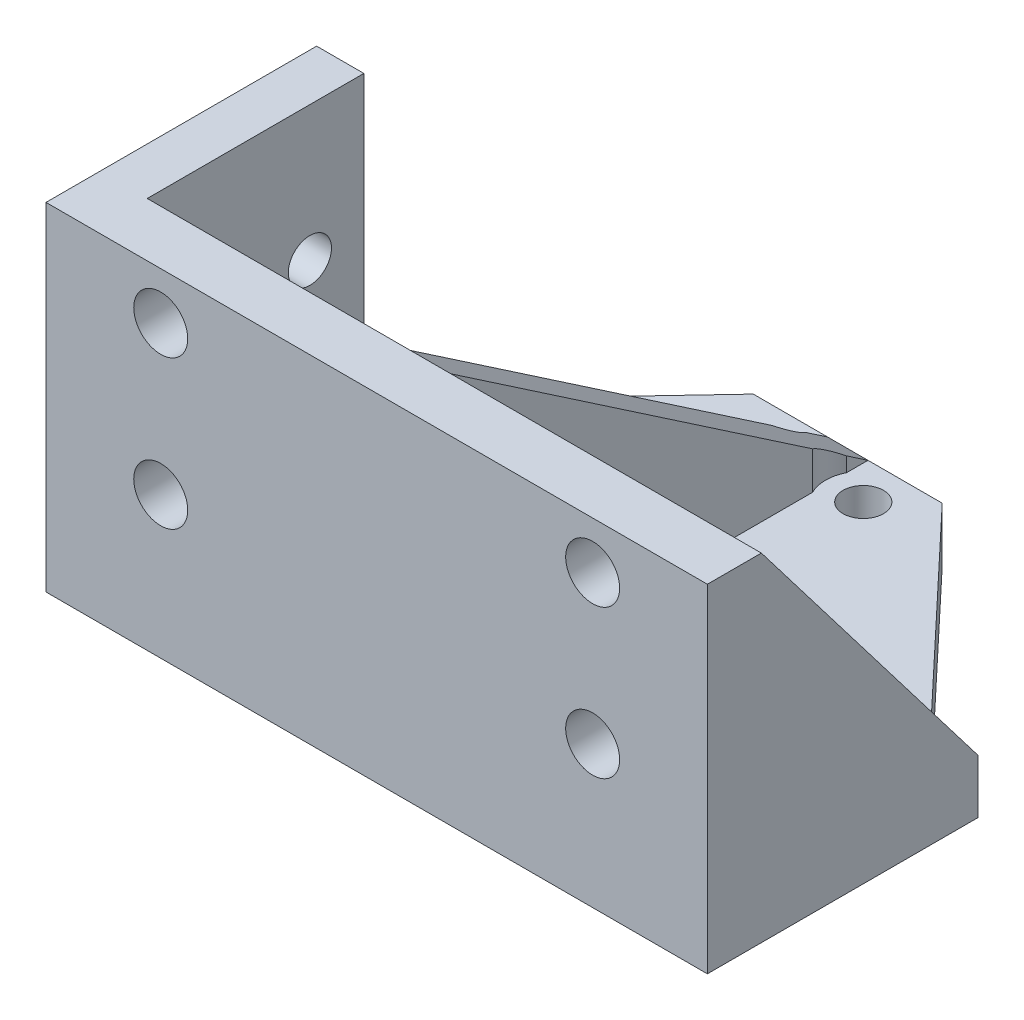
ISO-10303-21;
HEADER;
FILE_DESCRIPTION(('STEP AP214'),'2;1');
FILE_NAME('part.step','',(''),(''),'','','');
FILE_SCHEMA(('AUTOMOTIVE_DESIGN { 1 0 10303 214 1 1 1 1 }'));
ENDSEC;
DATA;
#1=APPLICATION_CONTEXT('core data for automotive mechanical design processes');
#2=APPLICATION_PROTOCOL_DEFINITION('international standard','automotive_design',2000,#1);
#3=PRODUCT_CONTEXT('',#1,'mechanical');
#4=PRODUCT('Part','Part','',(#3));
#5=PRODUCT_RELATED_PRODUCT_CATEGORY('part','',(#4));
#6=PRODUCT_DEFINITION_FORMATION('','',#4);
#7=PRODUCT_DEFINITION_CONTEXT('part definition',#1,'design');
#8=PRODUCT_DEFINITION('design','',#6,#7);
#9=PRODUCT_DEFINITION_SHAPE('','',#8);
#10=(LENGTH_UNIT() NAMED_UNIT(*) SI_UNIT(.MILLI.,.METRE.));
#11=(NAMED_UNIT(*) PLANE_ANGLE_UNIT() SI_UNIT($,.RADIAN.));
#12=(NAMED_UNIT(*) SI_UNIT($,.STERADIAN.) SOLID_ANGLE_UNIT());
#13=UNCERTAINTY_MEASURE_WITH_UNIT(LENGTH_MEASURE(1.E-05),#10,'distance_accuracy_value','');
#14=(GEOMETRIC_REPRESENTATION_CONTEXT(3) GLOBAL_UNCERTAINTY_ASSIGNED_CONTEXT((#13)) GLOBAL_UNIT_ASSIGNED_CONTEXT((#10,
#11,#12)) REPRESENTATION_CONTEXT('',''));
#15=CARTESIAN_POINT('',(0.,0.,0.));
#16=DIRECTION('',(0.,0.,1.));
#17=DIRECTION('',(1.,0.,0.));
#18=AXIS2_PLACEMENT_3D('',#15,#16,#17);
#19=CARTESIAN_POINT('',(23.,0.,0.));
#20=DIRECTION('',(-1.,0.,0.));
#21=DIRECTION('',(0.,0.,1.));
#22=AXIS2_PLACEMENT_3D('',#19,#20,#21);
#23=PLANE('',#22);
#24=DIRECTION('',(0.,1.,0.));
#25=VECTOR('',#24,1.);
#26=CARTESIAN_POINT('',(23.,1.46031498015992,-30.7890479787081));
#27=LINE('',#26,#25);
#28=CARTESIAN_POINT('',(23.,4.,-30.7890479787081));
#29=VERTEX_POINT('',#28);
#30=CARTESIAN_POINT('',(23.,6.7938508882566,-30.7890479787081));
#31=VERTEX_POINT('',#30);
#32=EDGE_CURVE('E52',#29,#31,#27,.T.);
#33=ORIENTED_EDGE('',*,*,#32,.F.);
#34=DIRECTION('',(0.,0.,-1.));
#35=VECTOR('',#34,1.);
#36=CARTESIAN_POINT('',(23.,4.,-34.9));
#37=LINE('',#36,#35);
#38=CARTESIAN_POINT('',(23.,4.,-4.));
#39=VERTEX_POINT('',#38);
#40=EDGE_CURVE('E193',#39,#29,#37,.T.);
#41=ORIENTED_EDGE('',*,*,#40,.F.);
#42=DIRECTION('',(0.,-1.,0.));
#43=VECTOR('',#42,1.);
#44=CARTESIAN_POINT('',(23.,4.,-4.));
#45=LINE('',#44,#43);
#46=CARTESIAN_POINT('',(23.,25.,-4.));
#47=VERTEX_POINT('',#46);
#48=EDGE_CURVE('E382',#47,#39,#45,.T.);
#49=ORIENTED_EDGE('',*,*,#48,.F.);
#50=DIRECTION('',(0.,0.562090366387661,0.827075824827558));
#51=VECTOR('',#50,1.);
#52=CARTESIAN_POINT('',(23.,25.,-4.));
#53=LINE('',#52,#51);
#54=EDGE_CURVE('E369',#31,#47,#53,.T.);
#55=ORIENTED_EDGE('',*,*,#54,.F.);
#56=EDGE_LOOP('',(#33,#41,#49,#55));
#57=FACE_BOUND('',#56,.T.);
#58=ADVANCED_FACE('F36',(#57),#23,.T.);
#59=CARTESIAN_POINT('',(26.,0.,0.));
#60=DIRECTION('',(-1.,0.,0.));
#61=DIRECTION('',(0.,0.,1.));
#62=AXIS2_PLACEMENT_3D('',#59,#60,#61);
#63=PLANE('',#62);
#64=DIRECTION('',(0.,0.,-1.));
#65=VECTOR('',#64,1.);
#66=CARTESIAN_POINT('',(26.,4.,-34.9));
#67=LINE('',#66,#65);
#68=CARTESIAN_POINT('',(26.,4.,-4.));
#69=VERTEX_POINT('',#68);
#70=CARTESIAN_POINT('',(26.,4.,-30.7890479787081));
#71=VERTEX_POINT('',#70);
#72=EDGE_CURVE('E380',#69,#71,#67,.T.);
#73=ORIENTED_EDGE('',*,*,#72,.T.);
#74=DIRECTION('',(0.,1.,0.));
#75=VECTOR('',#74,1.);
#76=CARTESIAN_POINT('',(26.,1.46031498015992,-30.7890479787081));
#77=LINE('',#76,#75);
#78=CARTESIAN_POINT('',(26.,6.7938508882566,-30.7890479787081));
#79=VERTEX_POINT('',#78);
#80=EDGE_CURVE('E347',#71,#79,#77,.T.);
#81=ORIENTED_EDGE('',*,*,#80,.T.);
#82=DIRECTION('',(0.,0.562090366387661,0.827075824827558));
#83=VECTOR('',#82,1.);
#84=CARTESIAN_POINT('',(26.,25.,-4.));
#85=LINE('',#84,#83);
#86=CARTESIAN_POINT('',(26.,25.,-4.));
#87=VERTEX_POINT('',#86);
#88=EDGE_CURVE('E326',#79,#87,#85,.T.);
#89=ORIENTED_EDGE('',*,*,#88,.T.);
#90=DIRECTION('',(0.,-1.,0.));
#91=VECTOR('',#90,1.);
#92=CARTESIAN_POINT('',(26.,4.,-4.));
#93=LINE('',#92,#91);
#94=EDGE_CURVE('E376',#87,#69,#93,.T.);
#95=ORIENTED_EDGE('',*,*,#94,.T.);
#96=EDGE_LOOP('',(#73,#81,#89,#95));
#97=FACE_BOUND('',#96,.T.);
#98=ADVANCED_FACE('F436',(#97),#63,.F.);
#99=CARTESIAN_POINT('',(49.,4.,-34.9));
#100=DIRECTION('',(0.,-1.,0.));
#101=DIRECTION('',(0.,0.,-1.));
#102=AXIS2_PLACEMENT_3D('',#99,#100,#101);
#103=PLANE('',#102);
#104=CARTESIAN_POINT('',(42.5,4.,-15.55));
#105=DIRECTION('',(0.,1.,0.));
#106=DIRECTION('',(0.,0.,1.));
#107=AXIS2_PLACEMENT_3D('',#104,#105,#106);
#108=CIRCLE('',#107,1.5);
#109=CARTESIAN_POINT('',(42.5,4.,-14.05));
#110=VERTEX_POINT('',#109);
#111=EDGE_CURVE('E245',#110,#110,#108,.T.);
#112=ORIENTED_EDGE('',*,*,#111,.F.);
#113=EDGE_LOOP('',(#112));
#114=FACE_BOUND('',#113,.T.);
#115=CARTESIAN_POINT('',(28.5,4.,-32.05));
#116=DIRECTION('',(0.,1.,0.));
#117=DIRECTION('',(0.,0.,-1.));
#118=AXIS2_PLACEMENT_3D('',#115,#116,#117);
#119=CIRCLE('',#118,1.5);
#120=CARTESIAN_POINT('',(28.5,4.,-33.55));
#121=VERTEX_POINT('',#120);
#122=EDGE_CURVE('E272',#121,#121,#119,.T.);
#123=ORIENTED_EDGE('',*,*,#122,.F.);
#124=EDGE_LOOP('',(#123));
#125=FACE_BOUND('',#124,.T.);
#126=CARTESIAN_POINT('',(29.5,4.,-8.55));
#127=DIRECTION('',(0.,1.,0.));
#128=DIRECTION('',(0.,0.,1.));
#129=AXIS2_PLACEMENT_3D('',#126,#127,#128);
#130=CIRCLE('',#129,1.5);
#131=CARTESIAN_POINT('',(29.5,4.,-7.05));
#132=VERTEX_POINT('',#131);
#133=EDGE_CURVE('E215',#132,#132,#130,.T.);
#134=ORIENTED_EDGE('',*,*,#133,.F.);
#135=EDGE_LOOP('',(#134));
#136=FACE_BOUND('',#135,.T.);
#137=ORIENTED_EDGE('',*,*,#72,.F.);
#138=DIRECTION('',(-1.,0.,0.));
#139=VECTOR('',#138,1.);
#140=CARTESIAN_POINT('',(49.,4.,-4.));
#141=LINE('',#140,#139);
#142=CARTESIAN_POINT('',(45.5,4.,-4.));
#143=VERTEX_POINT('',#142);
#144=EDGE_CURVE('E304',#143,#69,#141,.T.);
#145=ORIENTED_EDGE('',*,*,#144,.F.);
#146=DIRECTION('',(0.,0.,1.));
#147=VECTOR('',#146,1.);
#148=CARTESIAN_POINT('',(45.5,4.,-34.9));
#149=LINE('',#148,#147);
#150=CARTESIAN_POINT('',(45.5,4.,-20.05));
#151=VERTEX_POINT('',#150);
#152=EDGE_CURVE('E209',#151,#143,#149,.T.);
#153=ORIENTED_EDGE('',*,*,#152,.F.);
#154=DIRECTION('',(0.685975812061838,0.,0.727624343508449));
#155=VECTOR('',#154,1.);
#156=CARTESIAN_POINT('',(31.5,4.,-34.9));
#157=LINE('',#156,#155);
#158=CARTESIAN_POINT('',(31.5,4.,-34.9));
#159=VERTEX_POINT('',#158);
#160=EDGE_CURVE('E232',#159,#151,#157,.T.);
#161=ORIENTED_EDGE('',*,*,#160,.F.);
#162=DIRECTION('',(-1.,0.,0.));
#163=VECTOR('',#162,1.);
#164=CARTESIAN_POINT('',(49.,4.,-34.9));
#165=LINE('',#164,#163);
#166=CARTESIAN_POINT('',(26.,4.,-34.9));
#167=VERTEX_POINT('',#166);
#168=EDGE_CURVE('E308',#159,#167,#165,.T.);
#169=ORIENTED_EDGE('',*,*,#168,.T.);
#170=CARTESIAN_POINT('',(26.,4.,-33.3109520212919));
#171=VERTEX_POINT('',#170);
#172=EDGE_CURVE('E379',#171,#167,#67,.T.);
#173=ORIENTED_EDGE('',*,*,#172,.F.);
#174=CARTESIAN_POINT('',(28.5,4.,-32.05));
#175=DIRECTION('',(0.,-1.,0.));
#176=DIRECTION('',(0.,0.,-1.));
#177=AXIS2_PLACEMENT_3D('',#174,#175,#176);
#178=CIRCLE('',#177,2.8);
#179=EDGE_CURVE('E351',#171,#71,#178,.F.);
#180=ORIENTED_EDGE('',*,*,#179,.T.);
#181=EDGE_LOOP('',(#137,#145,#153,#161,#169,#173,#180));
#182=FACE_BOUND('',#181,.T.);
#183=ADVANCED_FACE('F441',(#114,#125,#136,#182),#103,.F.);
#184=CARTESIAN_POINT('',(49.,4.,-4.));
#185=DIRECTION('',(0.,0.,1.));
#186=DIRECTION('',(1.,0.,0.));
#187=AXIS2_PLACEMENT_3D('',#184,#185,#186);
#188=PLANE('',#187);
#189=CARTESIAN_POINT('',(40.5,21.4999999999999,-4.));
#190=DIRECTION('',(0.,0.,-1.));
#191=DIRECTION('',(0.,1.,0.));
#192=AXIS2_PLACEMENT_3D('',#189,#190,#191);
#193=CIRCLE('',#192,2.00000000000008);
#194=CARTESIAN_POINT('',(40.5,23.5,-4.));
#195=VERTEX_POINT('',#194);
#196=EDGE_CURVE('E350',#195,#195,#193,.T.);
#197=ORIENTED_EDGE('',*,*,#196,.F.);
#198=EDGE_LOOP('',(#197));
#199=FACE_BOUND('',#198,.T.);
#200=CARTESIAN_POINT('',(40.5,10.4999999999999,-4.));
#201=DIRECTION('',(0.,0.,-1.));
#202=DIRECTION('',(0.,1.,0.));
#203=AXIS2_PLACEMENT_3D('',#200,#201,#202);
#204=CIRCLE('',#203,2.00000000000007);
#205=CARTESIAN_POINT('',(40.5,12.5,-4.));
#206=VERTEX_POINT('',#205);
#207=EDGE_CURVE('E359',#206,#206,#204,.T.);
#208=ORIENTED_EDGE('',*,*,#207,.F.);
#209=EDGE_LOOP('',(#208));
#210=FACE_BOUND('',#209,.T.);
#211=ORIENTED_EDGE('',*,*,#94,.F.);
#212=DIRECTION('',(-1.,0.,0.));
#213=VECTOR('',#212,1.);
#214=CARTESIAN_POINT('',(49.,25.,-4.));
#215=LINE('',#214,#213);
#216=CARTESIAN_POINT('',(45.5,25.,-4.));
#217=VERTEX_POINT('',#216);
#218=EDGE_CURVE('E185',#217,#87,#215,.T.);
#219=ORIENTED_EDGE('',*,*,#218,.F.);
#220=DIRECTION('',(0.,1.,0.));
#221=VECTOR('',#220,1.);
#222=CARTESIAN_POINT('',(45.5,4.,-4.));
#223=LINE('',#222,#221);
#224=EDGE_CURVE('E205',#143,#217,#223,.T.);
#225=ORIENTED_EDGE('',*,*,#224,.F.);
#226=ORIENTED_EDGE('',*,*,#144,.T.);
#227=EDGE_LOOP('',(#211,#219,#225,#226));
#228=FACE_BOUND('',#227,.T.);
#229=ADVANCED_FACE('F519',(#199,#210,#228),#188,.F.);
#230=CARTESIAN_POINT('',(20.5,4.,-32.05));
#231=DIRECTION('',(0.,1.,0.));
#232=DIRECTION('',(0.,0.,1.));
#233=AXIS2_PLACEMENT_3D('',#230,#231,#232);
#234=CIRCLE('',#233,1.5);
#235=CARTESIAN_POINT('',(20.5,4.,-30.55));
#236=VERTEX_POINT('',#235);
#237=EDGE_CURVE('E271',#236,#236,#234,.T.);
#238=ORIENTED_EDGE('',*,*,#237,.F.);
#239=EDGE_LOOP('',(#238));
#240=FACE_BOUND('',#239,.T.);
#241=CARTESIAN_POINT('',(19.5,4.,-8.55));
#242=DIRECTION('',(0.,1.,0.));
#243=DIRECTION('',(0.,0.,-1.));
#244=AXIS2_PLACEMENT_3D('',#241,#242,#243);
#245=CIRCLE('',#244,1.5);
#246=CARTESIAN_POINT('',(19.5,4.,-10.05));
#247=VERTEX_POINT('',#246);
#248=EDGE_CURVE('E211',#247,#247,#245,.T.);
#249=ORIENTED_EDGE('',*,*,#248,.F.);
#250=EDGE_LOOP('',(#249));
#251=FACE_BOUND('',#250,.T.);
#252=CARTESIAN_POINT('',(6.50000000000001,4.,-15.55));
#253=DIRECTION('',(0.,1.,0.));
#254=DIRECTION('',(0.,0.,-1.));
#255=AXIS2_PLACEMENT_3D('',#252,#253,#254);
#256=CIRCLE('',#255,1.5);
#257=CARTESIAN_POINT('',(6.50000000000001,4.,-17.05));
#258=VERTEX_POINT('',#257);
#259=EDGE_CURVE('E246',#258,#258,#256,.T.);
#260=ORIENTED_EDGE('',*,*,#259,.F.);
#261=EDGE_LOOP('',(#260));
#262=FACE_BOUND('',#261,.T.);
#263=CARTESIAN_POINT('',(3.5,4.,-4.));
#264=VERTEX_POINT('',#263);
#265=EDGE_CURVE('E191',#39,#264,#141,.T.);
#266=ORIENTED_EDGE('',*,*,#265,.F.);
#267=ORIENTED_EDGE('',*,*,#40,.T.);
#268=CARTESIAN_POINT('',(20.5,4.,-32.05));
#269=DIRECTION('',(0.,-1.,0.));
#270=DIRECTION('',(0.,0.,-1.));
#271=AXIS2_PLACEMENT_3D('',#268,#269,#270);
#272=CIRCLE('',#271,2.8);
#273=CARTESIAN_POINT('',(23.,4.,-33.3109520212918));
#274=VERTEX_POINT('',#273);
#275=EDGE_CURVE('E343',#29,#274,#272,.F.);
#276=ORIENTED_EDGE('',*,*,#275,.T.);
#277=CARTESIAN_POINT('',(23.,4.,-34.9));
#278=VERTEX_POINT('',#277);
#279=EDGE_CURVE('E198',#274,#278,#37,.T.);
#280=ORIENTED_EDGE('',*,*,#279,.T.);
#281=CARTESIAN_POINT('',(17.5,4.,-34.9));
#282=VERTEX_POINT('',#281);
#283=EDGE_CURVE('E307',#278,#282,#165,.T.);
#284=ORIENTED_EDGE('',*,*,#283,.T.);
#285=DIRECTION('',(0.685975812061838,0.,-0.727624343508449));
#286=VECTOR('',#285,1.);
#287=CARTESIAN_POINT('',(17.5,4.,-34.9));
#288=LINE('',#287,#286);
#289=CARTESIAN_POINT('',(3.5,4.,-20.05));
#290=VERTEX_POINT('',#289);
#291=EDGE_CURVE('E222',#290,#282,#288,.T.);
#292=ORIENTED_EDGE('',*,*,#291,.F.);
#293=DIRECTION('',(0.,0.,1.));
#294=VECTOR('',#293,1.);
#295=CARTESIAN_POINT('',(3.5,4.,-34.9));
#296=LINE('',#295,#294);
#297=EDGE_CURVE('E192',#290,#264,#296,.T.);
#298=ORIENTED_EDGE('',*,*,#297,.T.);
#299=EDGE_LOOP('',(#266,#267,#276,#280,#284,#292,#298));
#300=FACE_BOUND('',#299,.T.);
#301=ADVANCED_FACE('F387',(#240,#251,#262,#300),#103,.F.);
#302=CARTESIAN_POINT('',(8.49999999999998,10.4999999999999,-4.));
#303=DIRECTION('',(0.,0.,-1.));
#304=DIRECTION('',(0.,1.,0.));
#305=AXIS2_PLACEMENT_3D('',#302,#303,#304);
#306=CIRCLE('',#305,2.00000000000005);
#307=CARTESIAN_POINT('',(8.49999999999998,12.5,-4.));
#308=VERTEX_POINT('',#307);
#309=EDGE_CURVE('E356',#308,#308,#306,.T.);
#310=ORIENTED_EDGE('',*,*,#309,.F.);
#311=EDGE_LOOP('',(#310));
#312=FACE_BOUND('',#311,.T.);
#313=CARTESIAN_POINT('',(8.5,21.4999999999999,-4.));
#314=DIRECTION('',(0.,0.,-1.));
#315=DIRECTION('',(0.,1.,0.));
#316=AXIS2_PLACEMENT_3D('',#313,#314,#315);
#317=CIRCLE('',#316,2.00000000000007);
#318=CARTESIAN_POINT('',(8.5,23.5,-4.));
#319=VERTEX_POINT('',#318);
#320=EDGE_CURVE('E317',#319,#319,#317,.T.);
#321=ORIENTED_EDGE('',*,*,#320,.F.);
#322=EDGE_LOOP('',(#321));
#323=FACE_BOUND('',#322,.T.);
#324=CARTESIAN_POINT('',(3.5,25.,-4.));
#325=VERTEX_POINT('',#324);
#326=EDGE_CURVE('E177',#47,#325,#215,.T.);
#327=ORIENTED_EDGE('',*,*,#326,.F.);
#328=ORIENTED_EDGE('',*,*,#48,.T.);
#329=ORIENTED_EDGE('',*,*,#265,.T.);
#330=DIRECTION('',(0.,1.,0.));
#331=VECTOR('',#330,1.);
#332=CARTESIAN_POINT('',(3.5,4.,-4.));
#333=LINE('',#332,#331);
#334=EDGE_CURVE('E168',#264,#325,#333,.T.);
#335=ORIENTED_EDGE('',*,*,#334,.T.);
#336=EDGE_LOOP('',(#327,#328,#329,#335));
#337=FACE_BOUND('',#336,.T.);
#338=ADVANCED_FACE('F189',(#312,#323,#337),#188,.F.);
#339=CARTESIAN_POINT('',(49.,0.,-34.9));
#340=DIRECTION('',(0.,1.,0.));
#341=DIRECTION('',(0.,0.,1.));
#342=AXIS2_PLACEMENT_3D('',#339,#340,#341);
#343=PLANE('',#342);
#344=DIRECTION('',(0.685975812061838,0.,-0.727624343508449));
#345=VECTOR('',#344,1.);
#346=CARTESIAN_POINT('',(17.5,0.,-34.9));
#347=LINE('',#346,#345);
#348=CARTESIAN_POINT('',(3.5,0.,-20.05));
#349=VERTEX_POINT('',#348);
#350=CARTESIAN_POINT('',(17.5,0.,-34.9));
#351=VERTEX_POINT('',#350);
#352=EDGE_CURVE('E221',#349,#351,#347,.T.);
#353=ORIENTED_EDGE('',*,*,#352,.T.);
#354=DIRECTION('',(-1.,0.,0.));
#355=VECTOR('',#354,1.);
#356=CARTESIAN_POINT('',(49.,0.,-34.9));
#357=LINE('',#356,#355);
#358=CARTESIAN_POINT('',(31.5,0.,-34.9));
#359=VERTEX_POINT('',#358);
#360=EDGE_CURVE('E311',#359,#351,#357,.T.);
#361=ORIENTED_EDGE('',*,*,#360,.F.);
#362=DIRECTION('',(0.685975812061838,0.,0.727624343508449));
#363=VECTOR('',#362,1.);
#364=CARTESIAN_POINT('',(31.5,0.,-34.9));
#365=LINE('',#364,#363);
#366=CARTESIAN_POINT('',(45.5,0.,-20.05));
#367=VERTEX_POINT('',#366);
#368=EDGE_CURVE('E250',#359,#367,#365,.T.);
#369=ORIENTED_EDGE('',*,*,#368,.T.);
#370=DIRECTION('',(1.,0.,0.));
#371=VECTOR('',#370,1.);
#372=CARTESIAN_POINT('',(49.,0.,-20.05));
#373=LINE('',#372,#371);
#374=CARTESIAN_POINT('',(49.,0.,-20.05));
#375=VERTEX_POINT('',#374);
#376=EDGE_CURVE('E253',#367,#375,#373,.T.);
#377=ORIENTED_EDGE('',*,*,#376,.T.);
#378=DIRECTION('',(0.,0.,-1.));
#379=VECTOR('',#378,1.);
#380=CARTESIAN_POINT('',(49.,0.,-34.9));
#381=LINE('',#380,#379);
#382=CARTESIAN_POINT('',(49.,0.,0.));
#383=VERTEX_POINT('',#382);
#384=EDGE_CURVE('E286',#383,#375,#381,.T.);
#385=ORIENTED_EDGE('',*,*,#384,.F.);
#386=DIRECTION('',(-1.,0.,0.));
#387=VECTOR('',#386,1.);
#388=CARTESIAN_POINT('',(49.,0.,0.));
#389=LINE('',#388,#387);
#390=CARTESIAN_POINT('',(0.,0.,0.));
#391=VERTEX_POINT('',#390);
#392=EDGE_CURVE('E294',#383,#391,#389,.T.);
#393=ORIENTED_EDGE('',*,*,#392,.T.);
#394=DIRECTION('',(0.,0.,-1.));
#395=VECTOR('',#394,1.);
#396=CARTESIAN_POINT('',(0.,0.,-34.9));
#397=LINE('',#396,#395);
#398=CARTESIAN_POINT('',(0.,0.,-20.05));
#399=VERTEX_POINT('',#398);
#400=EDGE_CURVE('E283',#391,#399,#397,.T.);
#401=ORIENTED_EDGE('',*,*,#400,.T.);
#402=DIRECTION('',(1.,0.,0.));
#403=VECTOR('',#402,1.);
#404=CARTESIAN_POINT('',(0.,0.,-20.05));
#405=LINE('',#404,#403);
#406=EDGE_CURVE('E218',#399,#349,#405,.T.);
#407=ORIENTED_EDGE('',*,*,#406,.T.);
#408=EDGE_LOOP('',(#353,#361,#369,#377,#385,#393,#401,#407));
#409=FACE_BOUND('',#408,.T.);
#410=CARTESIAN_POINT('',(20.5,0.,-32.05));
#411=DIRECTION('',(0.,1.,0.));
#412=DIRECTION('',(0.,0.,1.));
#413=AXIS2_PLACEMENT_3D('',#410,#411,#412);
#414=CIRCLE('',#413,1.5);
#415=CARTESIAN_POINT('',(20.5,0.,-30.55));
#416=VERTEX_POINT('',#415);
#417=EDGE_CURVE('E280',#416,#416,#414,.T.);
#418=ORIENTED_EDGE('',*,*,#417,.T.);
#419=EDGE_LOOP('',(#418));
#420=FACE_BOUND('',#419,.T.);
#421=CARTESIAN_POINT('',(19.5,0.,-8.55));
#422=DIRECTION('',(0.,1.,0.));
#423=DIRECTION('',(0.,0.,-1.));
#424=AXIS2_PLACEMENT_3D('',#421,#422,#423);
#425=CIRCLE('',#424,1.5);
#426=CARTESIAN_POINT('',(19.5,0.,-10.05));
#427=VERTEX_POINT('',#426);
#428=EDGE_CURVE('E212',#427,#427,#425,.T.);
#429=ORIENTED_EDGE('',*,*,#428,.T.);
#430=EDGE_LOOP('',(#429));
#431=FACE_BOUND('',#430,.T.);
#432=CARTESIAN_POINT('',(6.50000000000001,0.,-15.55));
#433=DIRECTION('',(0.,1.,0.));
#434=DIRECTION('',(0.,0.,-1.));
#435=AXIS2_PLACEMENT_3D('',#432,#433,#434);
#436=CIRCLE('',#435,1.5);
#437=CARTESIAN_POINT('',(6.50000000000001,0.,-17.05));
#438=VERTEX_POINT('',#437);
#439=EDGE_CURVE('E242',#438,#438,#436,.T.);
#440=ORIENTED_EDGE('',*,*,#439,.T.);
#441=EDGE_LOOP('',(#440));
#442=FACE_BOUND('',#441,.T.);
#443=CARTESIAN_POINT('',(42.5,0.,-15.55));
#444=DIRECTION('',(0.,1.,0.));
#445=DIRECTION('',(0.,0.,1.));
#446=AXIS2_PLACEMENT_3D('',#443,#444,#445);
#447=CIRCLE('',#446,1.5);
#448=CARTESIAN_POINT('',(42.5,0.,-14.05));
#449=VERTEX_POINT('',#448);
#450=EDGE_CURVE('E275',#449,#449,#447,.T.);
#451=ORIENTED_EDGE('',*,*,#450,.T.);
#452=EDGE_LOOP('',(#451));
#453=FACE_BOUND('',#452,.T.);
#454=CARTESIAN_POINT('',(28.5,0.,-32.05));
#455=DIRECTION('',(0.,1.,0.));
#456=DIRECTION('',(0.,0.,-1.));
#457=AXIS2_PLACEMENT_3D('',#454,#455,#456);
#458=CIRCLE('',#457,1.5);
#459=CARTESIAN_POINT('',(28.5,0.,-33.55));
#460=VERTEX_POINT('',#459);
#461=EDGE_CURVE('E268',#460,#460,#458,.T.);
#462=ORIENTED_EDGE('',*,*,#461,.T.);
#463=EDGE_LOOP('',(#462));
#464=FACE_BOUND('',#463,.T.);
#465=CARTESIAN_POINT('',(29.5,0.,-8.55));
#466=DIRECTION('',(0.,1.,0.));
#467=DIRECTION('',(0.,0.,1.));
#468=AXIS2_PLACEMENT_3D('',#465,#466,#467);
#469=CIRCLE('',#468,1.5);
#470=CARTESIAN_POINT('',(29.5,0.,-7.05));
#471=VERTEX_POINT('',#470);
#472=EDGE_CURVE('E228',#471,#471,#469,.T.);
#473=ORIENTED_EDGE('',*,*,#472,.T.);
#474=EDGE_LOOP('',(#473));
#475=FACE_BOUND('',#474,.T.);
#476=ADVANCED_FACE('F38',(#409,#420,#431,#442,#453,#464,#475),#343,.F.);
#477=CARTESIAN_POINT('',(49.,4.,-34.9));
#478=DIRECTION('',(0.,0.,1.));
#479=DIRECTION('',(1.,0.,0.));
#480=AXIS2_PLACEMENT_3D('',#477,#478,#479);
#481=PLANE('',#480);
#482=ORIENTED_EDGE('',*,*,#283,.F.);
#483=DIRECTION('',(1.,0.,0.));
#484=VECTOR('',#483,1.);
#485=CARTESIAN_POINT('',(23.,4.,-34.9));
#486=LINE('',#485,#484);
#487=EDGE_CURVE('E373',#278,#167,#486,.T.);
#488=ORIENTED_EDGE('',*,*,#487,.T.);
#489=ORIENTED_EDGE('',*,*,#168,.F.);
#490=DIRECTION('',(0.,1.,0.));
#491=VECTOR('',#490,1.);
#492=CARTESIAN_POINT('',(31.5,0.,-34.9));
#493=LINE('',#492,#491);
#494=EDGE_CURVE('E257',#359,#159,#493,.T.);
#495=ORIENTED_EDGE('',*,*,#494,.F.);
#496=ORIENTED_EDGE('',*,*,#360,.T.);
#497=DIRECTION('',(0.,1.,0.));
#498=VECTOR('',#497,1.);
#499=CARTESIAN_POINT('',(17.5,0.,-34.9));
#500=LINE('',#499,#498);
#501=EDGE_CURVE('E233',#351,#282,#500,.T.);
#502=ORIENTED_EDGE('',*,*,#501,.T.);
#503=EDGE_LOOP('',(#482,#488,#489,#495,#496,#502));
#504=FACE_BOUND('',#503,.T.);
#505=ADVANCED_FACE('F399',(#504),#481,.F.);
#506=CARTESIAN_POINT('',(49.,25.,0.));
#507=DIRECTION('',(0.,-1.,0.));
#508=DIRECTION('',(0.,0.,-1.));
#509=AXIS2_PLACEMENT_3D('',#506,#507,#508);
#510=PLANE('',#509);
#511=DIRECTION('',(0.,0.,1.));
#512=VECTOR('',#511,1.);
#513=CARTESIAN_POINT('',(0.,25.,0.));
#514=LINE('',#513,#512);
#515=CARTESIAN_POINT('',(0.,25.,-20.05));
#516=VERTEX_POINT('',#515);
#517=CARTESIAN_POINT('',(0.,25.,0.));
#518=VERTEX_POINT('',#517);
#519=EDGE_CURVE('E297',#516,#518,#514,.T.);
#520=ORIENTED_EDGE('',*,*,#519,.T.);
#521=DIRECTION('',(-1.,0.,0.));
#522=VECTOR('',#521,1.);
#523=CARTESIAN_POINT('',(49.,25.,0.));
#524=LINE('',#523,#522);
#525=CARTESIAN_POINT('',(49.,25.,0.));
#526=VERTEX_POINT('',#525);
#527=EDGE_CURVE('E186',#526,#518,#524,.T.);
#528=ORIENTED_EDGE('',*,*,#527,.F.);
#529=DIRECTION('',(0.,0.,1.));
#530=VECTOR('',#529,1.);
#531=CARTESIAN_POINT('',(49.,25.,0.));
#532=LINE('',#531,#530);
#533=CARTESIAN_POINT('',(49.,25.,-4.));
#534=VERTEX_POINT('',#533);
#535=EDGE_CURVE('E289',#534,#526,#532,.T.);
#536=ORIENTED_EDGE('',*,*,#535,.F.);
#537=EDGE_CURVE('E188',#534,#217,#215,.T.);
#538=ORIENTED_EDGE('',*,*,#537,.T.);
#539=ORIENTED_EDGE('',*,*,#218,.T.);
#540=DIRECTION('',(1.,0.,0.));
#541=VECTOR('',#540,1.);
#542=CARTESIAN_POINT('',(23.,25.,-4.));
#543=LINE('',#542,#541);
#544=EDGE_CURVE('E182',#47,#87,#543,.T.);
#545=ORIENTED_EDGE('',*,*,#544,.F.);
#546=ORIENTED_EDGE('',*,*,#326,.T.);
#547=DIRECTION('',(0.,0.,1.));
#548=VECTOR('',#547,1.);
#549=CARTESIAN_POINT('',(3.5,25.,-4.));
#550=LINE('',#549,#548);
#551=CARTESIAN_POINT('',(3.5,25.,-20.05));
#552=VERTEX_POINT('',#551);
#553=EDGE_CURVE('E163',#552,#325,#550,.T.);
#554=ORIENTED_EDGE('',*,*,#553,.F.);
#555=DIRECTION('',(1.,0.,0.));
#556=VECTOR('',#555,1.);
#557=CARTESIAN_POINT('',(-26.4310896483668,25.,-20.05));
#558=LINE('',#557,#556);
#559=EDGE_CURVE('E173',#516,#552,#558,.T.);
#560=ORIENTED_EDGE('',*,*,#559,.F.);
#561=EDGE_LOOP('',(#520,#528,#536,#538,#539,#545,#546,#554,#560));
#562=FACE_BOUND('',#561,.T.);
#563=ADVANCED_FACE('F179',(#562),#510,.F.);
#564=CARTESIAN_POINT('',(49.,0.,0.));
#565=DIRECTION('',(0.,0.,-1.));
#566=DIRECTION('',(-1.,0.,0.));
#567=AXIS2_PLACEMENT_3D('',#564,#565,#566);
#568=PLANE('',#567);
#569=CARTESIAN_POINT('',(40.5,21.4999999999999,0.));
#570=DIRECTION('',(0.,0.,-1.));
#571=DIRECTION('',(-1.,0.,0.));
#572=AXIS2_PLACEMENT_3D('',#569,#570,#571);
#573=CIRCLE('',#572,2.00000000000008);
#574=CARTESIAN_POINT('',(38.4999999999999,21.4999999999999,0.));
#575=VERTEX_POINT('',#574);
#576=EDGE_CURVE('E323',#575,#575,#573,.T.);
#577=ORIENTED_EDGE('',*,*,#576,.T.);
#578=EDGE_LOOP('',(#577));
#579=FACE_BOUND('',#578,.T.);
#580=CARTESIAN_POINT('',(40.5,10.4999999999999,0.));
#581=DIRECTION('',(0.,0.,-1.));
#582=DIRECTION('',(-1.,0.,0.));
#583=AXIS2_PLACEMENT_3D('',#580,#581,#582);
#584=CIRCLE('',#583,2.00000000000007);
#585=CARTESIAN_POINT('',(38.4999999999999,10.4999999999999,0.));
#586=VERTEX_POINT('',#585);
#587=EDGE_CURVE('E320',#586,#586,#584,.T.);
#588=ORIENTED_EDGE('',*,*,#587,.T.);
#589=EDGE_LOOP('',(#588));
#590=FACE_BOUND('',#589,.T.);
#591=CARTESIAN_POINT('',(8.49999999999998,10.4999999999999,0.));
#592=DIRECTION('',(0.,0.,-1.));
#593=DIRECTION('',(-1.,0.,0.));
#594=AXIS2_PLACEMENT_3D('',#591,#592,#593);
#595=CIRCLE('',#594,2.00000000000005);
#596=CARTESIAN_POINT('',(6.49999999999993,10.4999999999999,0.));
#597=VERTEX_POINT('',#596);
#598=EDGE_CURVE('E316',#597,#597,#595,.T.);
#599=ORIENTED_EDGE('',*,*,#598,.T.);
#600=EDGE_LOOP('',(#599));
#601=FACE_BOUND('',#600,.T.);
#602=CARTESIAN_POINT('',(8.5,21.4999999999999,0.));
#603=DIRECTION('',(0.,0.,-1.));
#604=DIRECTION('',(-1.,0.,0.));
#605=AXIS2_PLACEMENT_3D('',#602,#603,#604);
#606=CIRCLE('',#605,2.00000000000007);
#607=CARTESIAN_POINT('',(6.49999999999992,21.4999999999999,0.));
#608=VERTEX_POINT('',#607);
#609=EDGE_CURVE('E313',#608,#608,#606,.T.);
#610=ORIENTED_EDGE('',*,*,#609,.T.);
#611=EDGE_LOOP('',(#610));
#612=FACE_BOUND('',#611,.T.);
#613=DIRECTION('',(0.,-1.,0.));
#614=VECTOR('',#613,1.);
#615=CARTESIAN_POINT('',(0.,0.,0.));
#616=LINE('',#615,#614);
#617=EDGE_CURVE('E290',#518,#391,#616,.T.);
#618=ORIENTED_EDGE('',*,*,#617,.T.);
#619=ORIENTED_EDGE('',*,*,#392,.F.);
#620=DIRECTION('',(0.,-1.,0.));
#621=VECTOR('',#620,1.);
#622=CARTESIAN_POINT('',(49.,0.,0.));
#623=LINE('',#622,#621);
#624=EDGE_CURVE('E292',#526,#383,#623,.T.);
#625=ORIENTED_EDGE('',*,*,#624,.F.);
#626=ORIENTED_EDGE('',*,*,#527,.T.);
#627=EDGE_LOOP('',(#618,#619,#625,#626));
#628=FACE_BOUND('',#627,.T.);
#629=ADVANCED_FACE('F506',(#579,#590,#601,#612,#628),#568,.F.);
#630=CARTESIAN_POINT('',(49.,0.,0.));
#631=DIRECTION('',(-1.,0.,0.));
#632=DIRECTION('',(0.,0.,1.));
#633=AXIS2_PLACEMENT_3D('',#630,#631,#632);
#634=PLANE('',#633);
#635=ORIENTED_EDGE('',*,*,#384,.T.);
#636=DIRECTION('',(0.,1.,0.));
#637=VECTOR('',#636,1.);
#638=CARTESIAN_POINT('',(49.,0.,-20.05));
#639=LINE('',#638,#637);
#640=CARTESIAN_POINT('',(49.,4.,-20.05));
#641=VERTEX_POINT('',#640);
#642=EDGE_CURVE('E249',#375,#641,#639,.T.);
#643=ORIENTED_EDGE('',*,*,#642,.T.);
#644=DIRECTION('',(0.,0.794518889662865,0.607239437099475));
#645=VECTOR('',#644,1.);
#646=CARTESIAN_POINT('',(49.,4.,-20.05));
#647=LINE('',#646,#645);
#648=EDGE_CURVE('E195',#641,#534,#647,.T.);
#649=ORIENTED_EDGE('',*,*,#648,.T.);
#650=ORIENTED_EDGE('',*,*,#535,.T.);
#651=ORIENTED_EDGE('',*,*,#624,.T.);
#652=EDGE_LOOP('',(#635,#643,#649,#650,#651));
#653=FACE_BOUND('',#652,.T.);
#654=ADVANCED_FACE('F503',(#653),#634,.F.);
#655=CARTESIAN_POINT('',(0.,0.,0.));
#656=DIRECTION('',(-1.,0.,0.));
#657=DIRECTION('',(0.,0.,1.));
#658=AXIS2_PLACEMENT_3D('',#655,#656,#657);
#659=PLANE('',#658);
#660=CARTESIAN_POINT('',(0.,15.,-8.05));
#661=DIRECTION('',(-1.,0.,0.));
#662=DIRECTION('',(0.,0.,1.));
#663=AXIS2_PLACEMENT_3D('',#660,#661,#662);
#664=CIRCLE('',#663,1.6);
#665=CARTESIAN_POINT('',(0.,15.,-6.45));
#666=VERTEX_POINT('',#665);
#667=EDGE_CURVE('E329',#666,#666,#664,.T.);
#668=ORIENTED_EDGE('',*,*,#667,.F.);
#669=EDGE_LOOP('',(#668));
#670=FACE_BOUND('',#669,.T.);
#671=CARTESIAN_POINT('',(0.,15.,-16.05));
#672=DIRECTION('',(-1.,0.,0.));
#673=DIRECTION('',(0.,0.,1.));
#674=AXIS2_PLACEMENT_3D('',#671,#672,#673);
#675=CIRCLE('',#674,1.6);
#676=CARTESIAN_POINT('',(0.,15.,-14.45));
#677=VERTEX_POINT('',#676);
#678=EDGE_CURVE('E334',#677,#677,#675,.T.);
#679=ORIENTED_EDGE('',*,*,#678,.F.);
#680=EDGE_LOOP('',(#679));
#681=FACE_BOUND('',#680,.T.);
#682=DIRECTION('',(0.,1.,0.));
#683=VECTOR('',#682,1.);
#684=CARTESIAN_POINT('',(0.,0.,-20.05));
#685=LINE('',#684,#683);
#686=EDGE_CURVE('E229',#399,#516,#685,.T.);
#687=ORIENTED_EDGE('',*,*,#686,.F.);
#688=ORIENTED_EDGE('',*,*,#400,.F.);
#689=ORIENTED_EDGE('',*,*,#617,.F.);
#690=ORIENTED_EDGE('',*,*,#519,.F.);
#691=EDGE_LOOP('',(#687,#688,#689,#690));
#692=FACE_BOUND('',#691,.T.);
#693=ADVANCED_FACE('F413',(#670,#681,#692),#659,.T.);
#694=CARTESIAN_POINT('',(0.,0.,-20.05));
#695=DIRECTION('',(0.,0.,1.));
#696=DIRECTION('',(1.,0.,0.));
#697=AXIS2_PLACEMENT_3D('',#694,#695,#696);
#698=PLANE('',#697);
#699=ORIENTED_EDGE('',*,*,#686,.T.);
#700=ORIENTED_EDGE('',*,*,#559,.T.);
#701=DIRECTION('',(0.,1.,0.));
#702=VECTOR('',#701,1.);
#703=CARTESIAN_POINT('',(3.5,25.,-20.05));
#704=LINE('',#703,#702);
#705=EDGE_CURVE('E170',#290,#552,#704,.T.);
#706=ORIENTED_EDGE('',*,*,#705,.F.);
#707=DIRECTION('',(0.,1.,0.));
#708=VECTOR('',#707,1.);
#709=CARTESIAN_POINT('',(3.5,0.,-20.05));
#710=LINE('',#709,#708);
#711=EDGE_CURVE('E225',#349,#290,#710,.T.);
#712=ORIENTED_EDGE('',*,*,#711,.F.);
#713=ORIENTED_EDGE('',*,*,#406,.F.);
#714=EDGE_LOOP('',(#699,#700,#706,#712,#713));
#715=FACE_BOUND('',#714,.T.);
#716=ADVANCED_FACE('F411',(#715),#698,.F.);
#717=CARTESIAN_POINT('',(17.5,0.,-34.9));
#718=DIRECTION('',(0.727624343508449,0.,0.685975812061838));
#719=DIRECTION('',(0.685975812061838,0.,-0.727624343508449));
#720=AXIS2_PLACEMENT_3D('',#717,#718,#719);
#721=PLANE('',#720);
#722=ORIENTED_EDGE('',*,*,#291,.T.);
#723=ORIENTED_EDGE('',*,*,#501,.F.);
#724=ORIENTED_EDGE('',*,*,#352,.F.);
#725=ORIENTED_EDGE('',*,*,#711,.T.);
#726=EDGE_LOOP('',(#722,#723,#724,#725));
#727=FACE_BOUND('',#726,.T.);
#728=ADVANCED_FACE('F405',(#727),#721,.F.);
#729=CARTESIAN_POINT('',(49.,0.,-20.05));
#730=DIRECTION('',(0.,0.,1.));
#731=DIRECTION('',(1.,0.,0.));
#732=AXIS2_PLACEMENT_3D('',#729,#730,#731);
#733=PLANE('',#732);
#734=DIRECTION('',(1.,0.,0.));
#735=VECTOR('',#734,1.);
#736=CARTESIAN_POINT('',(49.,4.,-20.05));
#737=LINE('',#736,#735);
#738=EDGE_CURVE('E254',#151,#641,#737,.T.);
#739=ORIENTED_EDGE('',*,*,#738,.T.);
#740=ORIENTED_EDGE('',*,*,#642,.F.);
#741=ORIENTED_EDGE('',*,*,#376,.F.);
#742=DIRECTION('',(0.,1.,0.));
#743=VECTOR('',#742,1.);
#744=CARTESIAN_POINT('',(45.5,0.,-20.05));
#745=LINE('',#744,#743);
#746=EDGE_CURVE('E264',#367,#151,#745,.T.);
#747=ORIENTED_EDGE('',*,*,#746,.T.);
#748=EDGE_LOOP('',(#739,#740,#741,#747));
#749=FACE_BOUND('',#748,.T.);
#750=ADVANCED_FACE('F476',(#749),#733,.F.);
#751=CARTESIAN_POINT('',(31.5,0.,-34.9));
#752=DIRECTION('',(-0.727624343508449,0.,0.685975812061838));
#753=DIRECTION('',(0.685975812061838,0.,0.727624343508449));
#754=AXIS2_PLACEMENT_3D('',#751,#752,#753);
#755=PLANE('',#754);
#756=ORIENTED_EDGE('',*,*,#160,.T.);
#757=ORIENTED_EDGE('',*,*,#746,.F.);
#758=ORIENTED_EDGE('',*,*,#368,.F.);
#759=ORIENTED_EDGE('',*,*,#494,.T.);
#760=EDGE_LOOP('',(#756,#757,#758,#759));
#761=FACE_BOUND('',#760,.T.);
#762=ADVANCED_FACE('F489',(#761),#755,.F.);
#763=CARTESIAN_POINT('',(20.5,0.,-32.05));
#764=DIRECTION('',(0.,1.,0.));
#765=DIRECTION('',(0.,0.,1.));
#766=AXIS2_PLACEMENT_3D('',#763,#764,#765);
#767=CYLINDRICAL_SURFACE('',#766,1.5);
#768=ORIENTED_EDGE('',*,*,#417,.F.);
#769=EDGE_LOOP('',(#768));
#770=FACE_BOUND('',#769,.T.);
#771=ORIENTED_EDGE('',*,*,#237,.T.);
#772=EDGE_LOOP('',(#771));
#773=FACE_BOUND('',#772,.T.);
#774=ADVANCED_FACE('F481',(#770,#773),#767,.F.);
#775=CARTESIAN_POINT('',(29.5,0.,-8.55));
#776=DIRECTION('',(0.,1.,0.));
#777=DIRECTION('',(0.,0.,1.));
#778=AXIS2_PLACEMENT_3D('',#775,#776,#777);
#779=CYLINDRICAL_SURFACE('',#778,1.5);
#780=ORIENTED_EDGE('',*,*,#472,.F.);
#781=EDGE_LOOP('',(#780));
#782=FACE_BOUND('',#781,.T.);
#783=ORIENTED_EDGE('',*,*,#133,.T.);
#784=EDGE_LOOP('',(#783));
#785=FACE_BOUND('',#784,.T.);
#786=ADVANCED_FACE('F472',(#782,#785),#779,.F.);
#787=CARTESIAN_POINT('',(19.5,0.,-8.55));
#788=DIRECTION('',(0.,1.,0.));
#789=DIRECTION('',(0.,0.,1.));
#790=AXIS2_PLACEMENT_3D('',#787,#788,#789);
#791=CYLINDRICAL_SURFACE('',#790,1.5);
#792=ORIENTED_EDGE('',*,*,#428,.F.);
#793=EDGE_LOOP('',(#792));
#794=FACE_BOUND('',#793,.T.);
#795=ORIENTED_EDGE('',*,*,#248,.T.);
#796=EDGE_LOOP('',(#795));
#797=FACE_BOUND('',#796,.T.);
#798=ADVANCED_FACE('F468',(#794,#797),#791,.F.);
#799=CARTESIAN_POINT('',(28.5,0.,-32.05));
#800=DIRECTION('',(0.,1.,0.));
#801=DIRECTION('',(0.,0.,1.));
#802=AXIS2_PLACEMENT_3D('',#799,#800,#801);
#803=CYLINDRICAL_SURFACE('',#802,1.5);
#804=ORIENTED_EDGE('',*,*,#461,.F.);
#805=EDGE_LOOP('',(#804));
#806=FACE_BOUND('',#805,.T.);
#807=ORIENTED_EDGE('',*,*,#122,.T.);
#808=EDGE_LOOP('',(#807));
#809=FACE_BOUND('',#808,.T.);
#810=ADVANCED_FACE('F471',(#806,#809),#803,.F.);
#811=CARTESIAN_POINT('',(42.5,0.,-15.55));
#812=DIRECTION('',(0.,1.,0.));
#813=DIRECTION('',(0.,0.,1.));
#814=AXIS2_PLACEMENT_3D('',#811,#812,#813);
#815=CYLINDRICAL_SURFACE('',#814,1.5);
#816=ORIENTED_EDGE('',*,*,#450,.F.);
#817=EDGE_LOOP('',(#816));
#818=FACE_BOUND('',#817,.T.);
#819=ORIENTED_EDGE('',*,*,#111,.T.);
#820=EDGE_LOOP('',(#819));
#821=FACE_BOUND('',#820,.T.);
#822=ADVANCED_FACE('F485',(#818,#821),#815,.F.);
#823=CARTESIAN_POINT('',(6.50000000000001,0.,-15.55));
#824=DIRECTION('',(0.,1.,0.));
#825=DIRECTION('',(0.,0.,1.));
#826=AXIS2_PLACEMENT_3D('',#823,#824,#825);
#827=CYLINDRICAL_SURFACE('',#826,1.5);
#828=ORIENTED_EDGE('',*,*,#439,.F.);
#829=EDGE_LOOP('',(#828));
#830=FACE_BOUND('',#829,.T.);
#831=ORIENTED_EDGE('',*,*,#259,.T.);
#832=EDGE_LOOP('',(#831));
#833=FACE_BOUND('',#832,.T.);
#834=ADVANCED_FACE('F465',(#830,#833),#827,.F.);
#835=CARTESIAN_POINT('',(45.5,0.,0.));
#836=DIRECTION('',(1.,0.,0.));
#837=DIRECTION('',(0.,0.,-1.));
#838=AXIS2_PLACEMENT_3D('',#835,#836,#837);
#839=PLANE('',#838);
#840=DIRECTION('',(0.,0.794518889662865,0.607239437099475));
#841=VECTOR('',#840,1.);
#842=CARTESIAN_POINT('',(45.5,4.,-20.05));
#843=LINE('',#842,#841);
#844=EDGE_CURVE('E202',#151,#217,#843,.T.);
#845=ORIENTED_EDGE('',*,*,#844,.F.);
#846=ORIENTED_EDGE('',*,*,#152,.T.);
#847=ORIENTED_EDGE('',*,*,#224,.T.);
#848=EDGE_LOOP('',(#845,#846,#847));
#849=FACE_BOUND('',#848,.T.);
#850=ADVANCED_FACE('F458',(#849),#839,.F.);
#851=CARTESIAN_POINT('',(45.5,4.,-20.05));
#852=DIRECTION('',(0.,0.607239437099476,-0.794518889662865));
#853=DIRECTION('',(0.,0.794518889662865,0.607239437099476));
#854=AXIS2_PLACEMENT_3D('',#851,#852,#853);
#855=PLANE('',#854);
#856=ORIENTED_EDGE('',*,*,#648,.F.);
#857=ORIENTED_EDGE('',*,*,#738,.F.);
#858=ORIENTED_EDGE('',*,*,#844,.T.);
#859=ORIENTED_EDGE('',*,*,#537,.F.);
#860=EDGE_LOOP('',(#856,#857,#858,#859));
#861=FACE_BOUND('',#860,.T.);
#862=ADVANCED_FACE('F452',(#861),#855,.T.);
#863=CARTESIAN_POINT('',(3.5,0.,0.));
#864=DIRECTION('',(1.,0.,0.));
#865=DIRECTION('',(0.,0.,-1.));
#866=AXIS2_PLACEMENT_3D('',#863,#864,#865);
#867=PLANE('',#866);
#868=CARTESIAN_POINT('',(3.5,15.,-8.05));
#869=DIRECTION('',(1.,0.,0.));
#870=DIRECTION('',(0.,0.,-1.));
#871=AXIS2_PLACEMENT_3D('',#868,#869,#870);
#872=CIRCLE('',#871,1.6);
#873=CARTESIAN_POINT('',(3.5,15.,-9.65));
#874=VERTEX_POINT('',#873);
#875=EDGE_CURVE('E40',#874,#874,#872,.T.);
#876=ORIENTED_EDGE('',*,*,#875,.F.);
#877=EDGE_LOOP('',(#876));
#878=FACE_BOUND('',#877,.T.);
#879=CARTESIAN_POINT('',(3.5,15.,-16.05));
#880=DIRECTION('',(1.,0.,0.));
#881=DIRECTION('',(0.,0.,-1.));
#882=AXIS2_PLACEMENT_3D('',#879,#880,#881);
#883=CIRCLE('',#882,1.6);
#884=CARTESIAN_POINT('',(3.5,15.,-17.65));
#885=VERTEX_POINT('',#884);
#886=EDGE_CURVE('E327',#885,#885,#883,.T.);
#887=ORIENTED_EDGE('',*,*,#886,.F.);
#888=EDGE_LOOP('',(#887));
#889=FACE_BOUND('',#888,.T.);
#890=ORIENTED_EDGE('',*,*,#297,.F.);
#891=ORIENTED_EDGE('',*,*,#705,.T.);
#892=ORIENTED_EDGE('',*,*,#553,.T.);
#893=ORIENTED_EDGE('',*,*,#334,.F.);
#894=EDGE_LOOP('',(#890,#891,#892,#893));
#895=FACE_BOUND('',#894,.T.);
#896=ADVANCED_FACE('F166',(#878,#889,#895),#867,.T.);
#897=DIRECTION('',(0.,1.,0.));
#898=VECTOR('',#897,1.);
#899=CARTESIAN_POINT('',(23.,1.46031498015992,-33.3109520212918));
#900=LINE('',#899,#898);
#901=CARTESIAN_POINT('',(23.,5.07993551951039,-33.3109520212918));
#902=VERTEX_POINT('',#901);
#903=EDGE_CURVE('E345',#274,#902,#900,.T.);
#904=ORIENTED_EDGE('',*,*,#903,.T.);
#905=EDGE_CURVE('E370',#278,#902,#53,.T.);
#906=ORIENTED_EDGE('',*,*,#905,.F.);
#907=ORIENTED_EDGE('',*,*,#279,.F.);
#908=EDGE_LOOP('',(#904,#906,#907));
#909=FACE_BOUND('',#908,.T.);
#910=ADVANCED_FACE('F398',(#909),#23,.T.);
#911=CARTESIAN_POINT('',(26.,5.07993551951039,-33.3109520212918));
#912=VERTEX_POINT('',#911);
#913=EDGE_CURVE('E366',#167,#912,#85,.T.);
#914=ORIENTED_EDGE('',*,*,#913,.T.);
#915=DIRECTION('',(0.,1.,0.));
#916=VECTOR('',#915,1.);
#917=CARTESIAN_POINT('',(26.,1.46031498015992,-33.3109520212919));
#918=LINE('',#917,#916);
#919=EDGE_CURVE('E60',#171,#912,#918,.T.);
#920=ORIENTED_EDGE('',*,*,#919,.F.);
#921=ORIENTED_EDGE('',*,*,#172,.T.);
#922=EDGE_LOOP('',(#914,#920,#921));
#923=FACE_BOUND('',#922,.T.);
#924=ADVANCED_FACE('F444',(#923),#63,.F.);
#925=CARTESIAN_POINT('',(23.,25.,-4.));
#926=DIRECTION('',(0.,0.827075824827558,-0.562090366387661));
#927=DIRECTION('',(0.,0.562090366387661,0.827075824827558));
#928=AXIS2_PLACEMENT_3D('',#925,#926,#927);
#929=PLANE('',#928);
#930=CARTESIAN_POINT('',(20.5,5.9368932038835,-32.05));
#931=DIRECTION('',(0.,0.827075824827558,-0.562090366387661));
#932=DIRECTION('',(0.,0.562090366387661,0.827075824827558));
#933=AXIS2_PLACEMENT_3D('',#930,#931,#932);
#934=ELLIPSE('',#933,3.38542116206067,2.8);
#935=EDGE_CURVE('E11',#31,#902,#934,.T.);
#936=ORIENTED_EDGE('',*,*,#935,.F.);
#937=ORIENTED_EDGE('',*,*,#54,.T.);
#938=ORIENTED_EDGE('',*,*,#544,.T.);
#939=ORIENTED_EDGE('',*,*,#88,.F.);
#940=CARTESIAN_POINT('',(28.5,5.9368932038835,-32.05));
#941=DIRECTION('',(0.,0.827075824827558,-0.562090366387661));
#942=DIRECTION('',(0.,0.562090366387661,0.827075824827558));
#943=AXIS2_PLACEMENT_3D('',#940,#941,#942);
#944=ELLIPSE('',#943,3.38542116206067,2.8);
#945=EDGE_CURVE('E45',#912,#79,#944,.T.);
#946=ORIENTED_EDGE('',*,*,#945,.F.);
#947=ORIENTED_EDGE('',*,*,#913,.F.);
#948=ORIENTED_EDGE('',*,*,#487,.F.);
#949=ORIENTED_EDGE('',*,*,#905,.T.);
#950=EDGE_LOOP('',(#936,#937,#938,#939,#946,#947,#948,#949));
#951=FACE_BOUND('',#950,.T.);
#952=ADVANCED_FACE('F395',(#951),#929,.T.);
#953=CARTESIAN_POINT('',(8.5,21.4999999999999,6.));
#954=DIRECTION('',(0.,0.,-1.));
#955=DIRECTION('',(0.,1.,0.));
#956=AXIS2_PLACEMENT_3D('',#953,#954,#955);
#957=CYLINDRICAL_SURFACE('',#956,2.00000000000007);
#958=ORIENTED_EDGE('',*,*,#320,.T.);
#959=EDGE_LOOP('',(#958));
#960=FACE_BOUND('',#959,.T.);
#961=ORIENTED_EDGE('',*,*,#609,.F.);
#962=EDGE_LOOP('',(#961));
#963=FACE_BOUND('',#962,.T.);
#964=ADVANCED_FACE('F588',(#960,#963),#957,.F.);
#965=CARTESIAN_POINT('',(8.49999999999998,10.4999999999999,6.));
#966=DIRECTION('',(0.,0.,-1.));
#967=DIRECTION('',(0.,1.,0.));
#968=AXIS2_PLACEMENT_3D('',#965,#966,#967);
#969=CYLINDRICAL_SURFACE('',#968,2.00000000000005);
#970=ORIENTED_EDGE('',*,*,#309,.T.);
#971=EDGE_LOOP('',(#970));
#972=FACE_BOUND('',#971,.T.);
#973=ORIENTED_EDGE('',*,*,#598,.F.);
#974=EDGE_LOOP('',(#973));
#975=FACE_BOUND('',#974,.T.);
#976=ADVANCED_FACE('F578',(#972,#975),#969,.F.);
#977=CARTESIAN_POINT('',(40.5,10.4999999999999,6.));
#978=DIRECTION('',(0.,0.,-1.));
#979=DIRECTION('',(0.,1.,0.));
#980=AXIS2_PLACEMENT_3D('',#977,#978,#979);
#981=CYLINDRICAL_SURFACE('',#980,2.00000000000007);
#982=ORIENTED_EDGE('',*,*,#207,.T.);
#983=EDGE_LOOP('',(#982));
#984=FACE_BOUND('',#983,.T.);
#985=ORIENTED_EDGE('',*,*,#587,.F.);
#986=EDGE_LOOP('',(#985));
#987=FACE_BOUND('',#986,.T.);
#988=ADVANCED_FACE('F568',(#984,#987),#981,.F.);
#989=CARTESIAN_POINT('',(40.5,21.4999999999999,6.));
#990=DIRECTION('',(0.,0.,-1.));
#991=DIRECTION('',(0.,1.,0.));
#992=AXIS2_PLACEMENT_3D('',#989,#990,#991);
#993=CYLINDRICAL_SURFACE('',#992,2.00000000000008);
#994=ORIENTED_EDGE('',*,*,#196,.T.);
#995=EDGE_LOOP('',(#994));
#996=FACE_BOUND('',#995,.T.);
#997=ORIENTED_EDGE('',*,*,#576,.F.);
#998=EDGE_LOOP('',(#997));
#999=FACE_BOUND('',#998,.T.);
#1000=ADVANCED_FACE('F433',(#996,#999),#993,.F.);
#1001=CARTESIAN_POINT('',(28.5,1.46031498015992,-32.05));
#1002=DIRECTION('',(0.,1.,0.));
#1003=DIRECTION('',(0.,0.,1.));
#1004=AXIS2_PLACEMENT_3D('',#1001,#1002,#1003);
#1005=CYLINDRICAL_SURFACE('',#1004,2.8);
#1006=ORIENTED_EDGE('',*,*,#945,.T.);
#1007=ORIENTED_EDGE('',*,*,#80,.F.);
#1008=ORIENTED_EDGE('',*,*,#179,.F.);
#1009=ORIENTED_EDGE('',*,*,#919,.T.);
#1010=EDGE_LOOP('',(#1006,#1007,#1008,#1009));
#1011=FACE_BOUND('',#1010,.T.);
#1012=ADVANCED_FACE('F425',(#1011),#1005,.F.);
#1013=CARTESIAN_POINT('',(20.5,1.46031498015992,-32.05));
#1014=DIRECTION('',(0.,1.,0.));
#1015=DIRECTION('',(0.,0.,1.));
#1016=AXIS2_PLACEMENT_3D('',#1013,#1014,#1015);
#1017=CYLINDRICAL_SURFACE('',#1016,2.8);
#1018=ORIENTED_EDGE('',*,*,#935,.T.);
#1019=ORIENTED_EDGE('',*,*,#903,.F.);
#1020=ORIENTED_EDGE('',*,*,#275,.F.);
#1021=ORIENTED_EDGE('',*,*,#32,.T.);
#1022=EDGE_LOOP('',(#1018,#1019,#1020,#1021));
#1023=FACE_BOUND('',#1022,.T.);
#1024=ADVANCED_FACE('F422',(#1023),#1017,.F.);
#1025=CARTESIAN_POINT('',(10.,15.,-16.05));
#1026=DIRECTION('',(-1.,0.,0.));
#1027=DIRECTION('',(0.,0.,1.));
#1028=AXIS2_PLACEMENT_3D('',#1025,#1026,#1027);
#1029=CYLINDRICAL_SURFACE('',#1028,1.6);
#1030=ORIENTED_EDGE('',*,*,#886,.T.);
#1031=EDGE_LOOP('',(#1030));
#1032=FACE_BOUND('',#1031,.T.);
#1033=ORIENTED_EDGE('',*,*,#678,.T.);
#1034=EDGE_LOOP('',(#1033));
#1035=FACE_BOUND('',#1034,.T.);
#1036=ADVANCED_FACE('F424',(#1032,#1035),#1029,.F.);
#1037=CARTESIAN_POINT('',(10.,15.,-8.05));
#1038=DIRECTION('',(-1.,0.,0.));
#1039=DIRECTION('',(0.,0.,1.));
#1040=AXIS2_PLACEMENT_3D('',#1037,#1038,#1039);
#1041=CYLINDRICAL_SURFACE('',#1040,1.6);
#1042=ORIENTED_EDGE('',*,*,#875,.T.);
#1043=EDGE_LOOP('',(#1042));
#1044=FACE_BOUND('',#1043,.T.);
#1045=ORIENTED_EDGE('',*,*,#667,.T.);
#1046=EDGE_LOOP('',(#1045));
#1047=FACE_BOUND('',#1046,.T.);
#1048=ADVANCED_FACE('F431',(#1044,#1047),#1041,.F.);
#1049=CLOSED_SHELL('',(#58,#98,#183,#229,#301,#338,#476,#505,#563,#629,#654,#693,#716,#728,#750,
#762,#774,#786,#798,#810,#822,#834,#850,#862,#896,#910,#924,#952,#964,#976,#988,#1000,#1012,
#1024,#1036,#1048));
#1050=MANIFOLD_SOLID_BREP('B2',#1049);
#1051=ADVANCED_BREP_SHAPE_REPRESENTATION('',(#18,#1050),#14);
#1052=SHAPE_DEFINITION_REPRESENTATION(#9,#1051);
ENDSEC;
END-ISO-10303-21;
